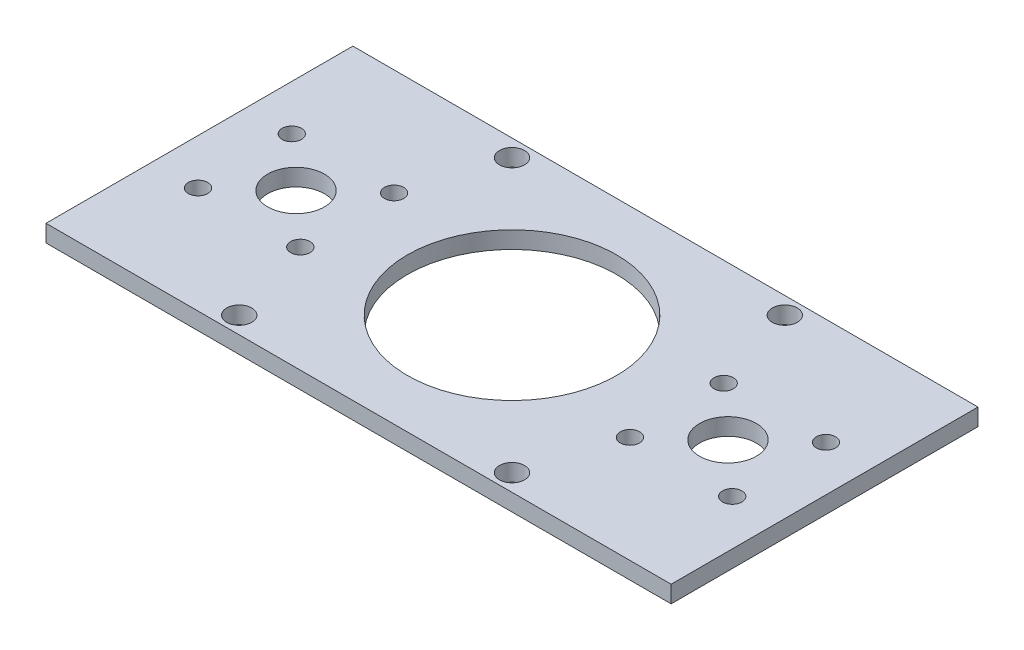
ISO-10303-21;
HEADER;
FILE_DESCRIPTION(('STEP AP214'),'2;1');
FILE_NAME('part.step','',(''),(''),'','','');
FILE_SCHEMA(('AUTOMOTIVE_DESIGN { 1 0 10303 214 1 1 1 1 }'));
ENDSEC;
DATA;
#1=APPLICATION_CONTEXT('core data for automotive mechanical design processes');
#2=APPLICATION_PROTOCOL_DEFINITION('international standard','automotive_design',2000,#1);
#3=PRODUCT_CONTEXT('',#1,'mechanical');
#4=PRODUCT('Part','Part','',(#3));
#5=PRODUCT_RELATED_PRODUCT_CATEGORY('part','',(#4));
#6=PRODUCT_DEFINITION_FORMATION('','',#4);
#7=PRODUCT_DEFINITION_CONTEXT('part definition',#1,'design');
#8=PRODUCT_DEFINITION('design','',#6,#7);
#9=PRODUCT_DEFINITION_SHAPE('','',#8);
#10=(LENGTH_UNIT() NAMED_UNIT(*) SI_UNIT(.MILLI.,.METRE.));
#11=(NAMED_UNIT(*) PLANE_ANGLE_UNIT() SI_UNIT($,.RADIAN.));
#12=(NAMED_UNIT(*) SI_UNIT($,.STERADIAN.) SOLID_ANGLE_UNIT());
#13=UNCERTAINTY_MEASURE_WITH_UNIT(LENGTH_MEASURE(1.E-05),#10,'distance_accuracy_value','');
#14=(GEOMETRIC_REPRESENTATION_CONTEXT(3) GLOBAL_UNCERTAINTY_ASSIGNED_CONTEXT((#13)) GLOBAL_UNIT_ASSIGNED_CONTEXT((#10,
#11,#12)) REPRESENTATION_CONTEXT('',''));
#15=CARTESIAN_POINT('',(0.,0.,0.));
#16=DIRECTION('',(0.,0.,1.));
#17=DIRECTION('',(1.,0.,0.));
#18=AXIS2_PLACEMENT_3D('',#15,#16,#17);
#19=CARTESIAN_POINT('',(0.,-54.75,0.));
#20=DIRECTION('',(0.,1.,0.));
#21=DIRECTION('',(-1.,0.,0.));
#22=AXIS2_PLACEMENT_3D('',#19,#20,#21);
#23=PLANE('',#22);
#24=CARTESIAN_POINT('',(29.0000000000001,-54.75,-68.25));
#25=DIRECTION('',(0.,1.,0.));
#26=DIRECTION('',(-1.,0.,0.));
#27=AXIS2_PLACEMENT_3D('',#24,#25,#26);
#28=CIRCLE('',#27,1.7);
#29=CARTESIAN_POINT('',(27.3000000000001,-54.75,-68.25));
#30=VERTEX_POINT('',#29);
#31=EDGE_CURVE('E510',#30,#30,#28,.F.);
#32=ORIENTED_EDGE('',*,*,#31,.F.);
#33=EDGE_LOOP('',(#32));
#34=FACE_BOUND('',#33,.T.);
#35=CARTESIAN_POINT('',(47.,-54.75,-68.25));
#36=DIRECTION('',(0.,1.,0.));
#37=DIRECTION('',(-1.,0.,0.));
#38=AXIS2_PLACEMENT_3D('',#35,#36,#37);
#39=CIRCLE('',#38,1.7);
#40=CARTESIAN_POINT('',(45.3,-54.75,-68.25));
#41=VERTEX_POINT('',#40);
#42=EDGE_CURVE('E113',#41,#41,#39,.F.);
#43=ORIENTED_EDGE('',*,*,#42,.F.);
#44=EDGE_LOOP('',(#43));
#45=FACE_BOUND('',#44,.T.);
#46=CARTESIAN_POINT('',(47.,-54.75,-51.75));
#47=DIRECTION('',(0.,1.,0.));
#48=DIRECTION('',(-1.,0.,0.));
#49=AXIS2_PLACEMENT_3D('',#46,#47,#48);
#50=CIRCLE('',#49,1.7);
#51=CARTESIAN_POINT('',(45.3,-54.75,-51.75));
#52=VERTEX_POINT('',#51);
#53=EDGE_CURVE('E121',#52,#52,#50,.T.);
#54=ORIENTED_EDGE('',*,*,#53,.T.);
#55=EDGE_LOOP('',(#54));
#56=FACE_BOUND('',#55,.T.);
#57=CARTESIAN_POINT('',(-47.,-54.75,-51.75));
#58=DIRECTION('',(0.,1.,0.));
#59=DIRECTION('',(-1.,0.,0.));
#60=AXIS2_PLACEMENT_3D('',#57,#58,#59);
#61=CIRCLE('',#60,1.7);
#62=CARTESIAN_POINT('',(-48.7,-54.75,-51.75));
#63=VERTEX_POINT('',#62);
#64=EDGE_CURVE('E124',#63,#63,#61,.F.);
#65=ORIENTED_EDGE('',*,*,#64,.F.);
#66=EDGE_LOOP('',(#65));
#67=FACE_BOUND('',#66,.T.);
#68=CARTESIAN_POINT('',(-47.,-54.75,-68.25));
#69=DIRECTION('',(0.,1.,0.));
#70=DIRECTION('',(-1.,0.,0.));
#71=AXIS2_PLACEMENT_3D('',#68,#69,#70);
#72=CIRCLE('',#71,1.7);
#73=CARTESIAN_POINT('',(-48.7,-54.75,-68.25));
#74=VERTEX_POINT('',#73);
#75=EDGE_CURVE('E547',#74,#74,#72,.T.);
#76=ORIENTED_EDGE('',*,*,#75,.T.);
#77=EDGE_LOOP('',(#76));
#78=FACE_BOUND('',#77,.T.);
#79=CARTESIAN_POINT('',(0.,-54.75,-60.));
#80=DIRECTION('',(0.,1.,0.));
#81=DIRECTION('',(-1.,0.,0.));
#82=AXIS2_PLACEMENT_3D('',#79,#80,#81);
#83=CIRCLE('',#82,18.4);
#84=CARTESIAN_POINT('',(-18.4,-54.75,-60.));
#85=VERTEX_POINT('',#84);
#86=EDGE_CURVE('E51',#85,#85,#83,.T.);
#87=ORIENTED_EDGE('',*,*,#86,.T.);
#88=EDGE_LOOP('',(#87));
#89=FACE_BOUND('',#88,.T.);
#90=CARTESIAN_POINT('',(-24.,-54.75,-84.));
#91=DIRECTION('',(0.,1.,0.));
#92=DIRECTION('',(-1.,0.,0.));
#93=AXIS2_PLACEMENT_3D('',#90,#91,#92);
#94=CIRCLE('',#93,2.2);
#95=CARTESIAN_POINT('',(-26.2,-54.75,-84.));
#96=VERTEX_POINT('',#95);
#97=EDGE_CURVE('E158',#96,#96,#94,.T.);
#98=ORIENTED_EDGE('',*,*,#97,.T.);
#99=EDGE_LOOP('',(#98));
#100=FACE_BOUND('',#99,.T.);
#101=CARTESIAN_POINT('',(24.,-54.75,-84.));
#102=DIRECTION('',(0.,1.,0.));
#103=DIRECTION('',(-1.,0.,0.));
#104=AXIS2_PLACEMENT_3D('',#101,#102,#103);
#105=CIRCLE('',#104,2.2);
#106=CARTESIAN_POINT('',(21.8,-54.75,-84.));
#107=VERTEX_POINT('',#106);
#108=EDGE_CURVE('E162',#107,#107,#105,.T.);
#109=ORIENTED_EDGE('',*,*,#108,.T.);
#110=EDGE_LOOP('',(#109));
#111=FACE_BOUND('',#110,.T.);
#112=CARTESIAN_POINT('',(24.,-54.75,-36.));
#113=DIRECTION('',(0.,1.,0.));
#114=DIRECTION('',(-1.,0.,0.));
#115=AXIS2_PLACEMENT_3D('',#112,#113,#114);
#116=CIRCLE('',#115,2.2);
#117=CARTESIAN_POINT('',(21.8,-54.75,-36.));
#118=VERTEX_POINT('',#117);
#119=EDGE_CURVE('E138',#118,#118,#116,.T.);
#120=ORIENTED_EDGE('',*,*,#119,.T.);
#121=EDGE_LOOP('',(#120));
#122=FACE_BOUND('',#121,.T.);
#123=CARTESIAN_POINT('',(-24.,-54.75,-36.));
#124=DIRECTION('',(0.,1.,0.));
#125=DIRECTION('',(-1.,0.,0.));
#126=AXIS2_PLACEMENT_3D('',#123,#124,#125);
#127=CIRCLE('',#126,2.2);
#128=CARTESIAN_POINT('',(-26.2,-54.75,-36.));
#129=VERTEX_POINT('',#128);
#130=EDGE_CURVE('E146',#129,#129,#127,.T.);
#131=ORIENTED_EDGE('',*,*,#130,.T.);
#132=EDGE_LOOP('',(#131));
#133=FACE_BOUND('',#132,.T.);
#134=DIRECTION('',(0.,0.,1.));
#135=VECTOR('',#134,1.);
#136=CARTESIAN_POINT('',(55.,-54.75,0.));
#137=LINE('',#136,#135);
#138=CARTESIAN_POINT('',(55.,-54.7500000000001,-87.));
#139=VERTEX_POINT('',#138);
#140=CARTESIAN_POINT('',(55.,-54.75,-33.));
#141=VERTEX_POINT('',#140);
#142=EDGE_CURVE('E517',#139,#141,#137,.T.);
#143=ORIENTED_EDGE('',*,*,#142,.T.);
#144=DIRECTION('',(-1.,0.,0.));
#145=VECTOR('',#144,1.);
#146=CARTESIAN_POINT('',(0.,-54.7500000000001,-33.));
#147=LINE('',#146,#145);
#148=CARTESIAN_POINT('',(-55.,-54.7500000000001,-33.));
#149=VERTEX_POINT('',#148);
#150=EDGE_CURVE('E63',#141,#149,#147,.T.);
#151=ORIENTED_EDGE('',*,*,#150,.T.);
#152=DIRECTION('',(0.,0.,1.));
#153=VECTOR('',#152,1.);
#154=CARTESIAN_POINT('',(-55.,-54.75,0.));
#155=LINE('',#154,#153);
#156=CARTESIAN_POINT('',(-55.,-54.7500000000001,-87.));
#157=VERTEX_POINT('',#156);
#158=EDGE_CURVE('E106',#157,#149,#155,.T.);
#159=ORIENTED_EDGE('',*,*,#158,.F.);
#160=DIRECTION('',(1.,0.,0.));
#161=VECTOR('',#160,1.);
#162=CARTESIAN_POINT('',(0.,-54.7500000000001,-87.));
#163=LINE('',#162,#161);
#164=EDGE_CURVE('E603',#157,#139,#163,.T.);
#165=ORIENTED_EDGE('',*,*,#164,.T.);
#166=EDGE_LOOP('',(#143,#151,#159,#165));
#167=FACE_BOUND('',#166,.T.);
#168=CARTESIAN_POINT('',(-38.,-54.75,-60.));
#169=DIRECTION('',(0.,1.,0.));
#170=DIRECTION('',(-1.,0.,0.));
#171=AXIS2_PLACEMENT_3D('',#168,#169,#170);
#172=CIRCLE('',#171,5.);
#173=CARTESIAN_POINT('',(-43.,-54.75,-60.));
#174=VERTEX_POINT('',#173);
#175=EDGE_CURVE('E544',#174,#174,#172,.F.);
#176=ORIENTED_EDGE('',*,*,#175,.F.);
#177=EDGE_LOOP('',(#176));
#178=FACE_BOUND('',#177,.T.);
#179=CARTESIAN_POINT('',(-29.0000000000001,-54.7500000000001,-68.25));
#180=DIRECTION('',(0.,1.,0.));
#181=DIRECTION('',(-1.,0.,0.));
#182=AXIS2_PLACEMENT_3D('',#179,#180,#181);
#183=CIRCLE('',#182,1.7);
#184=CARTESIAN_POINT('',(-30.7000000000001,-54.7500000000001,-68.25));
#185=VERTEX_POINT('',#184);
#186=EDGE_CURVE('E493',#185,#185,#183,.T.);
#187=ORIENTED_EDGE('',*,*,#186,.T.);
#188=EDGE_LOOP('',(#187));
#189=FACE_BOUND('',#188,.T.);
#190=CARTESIAN_POINT('',(-29.,-54.7500000000001,-51.75));
#191=DIRECTION('',(0.,1.,0.));
#192=DIRECTION('',(-1.,0.,0.));
#193=AXIS2_PLACEMENT_3D('',#190,#191,#192);
#194=CIRCLE('',#193,1.7);
#195=CARTESIAN_POINT('',(-30.7,-54.7500000000001,-51.75));
#196=VERTEX_POINT('',#195);
#197=EDGE_CURVE('E502',#196,#196,#194,.T.);
#198=ORIENTED_EDGE('',*,*,#197,.T.);
#199=EDGE_LOOP('',(#198));
#200=FACE_BOUND('',#199,.T.);
#201=CARTESIAN_POINT('',(38.,-54.75,-60.));
#202=DIRECTION('',(0.,1.,0.));
#203=DIRECTION('',(-1.,0.,0.));
#204=AXIS2_PLACEMENT_3D('',#201,#202,#203);
#205=CIRCLE('',#204,5.);
#206=CARTESIAN_POINT('',(33.,-54.75,-60.));
#207=VERTEX_POINT('',#206);
#208=EDGE_CURVE('E521',#207,#207,#205,.T.);
#209=ORIENTED_EDGE('',*,*,#208,.T.);
#210=EDGE_LOOP('',(#209));
#211=FACE_BOUND('',#210,.T.);
#212=CARTESIAN_POINT('',(29.,-54.75,-51.75));
#213=DIRECTION('',(0.,1.,0.));
#214=DIRECTION('',(-1.,0.,0.));
#215=AXIS2_PLACEMENT_3D('',#212,#213,#214);
#216=CIRCLE('',#215,1.7);
#217=CARTESIAN_POINT('',(27.3,-54.75,-51.75));
#218=VERTEX_POINT('',#217);
#219=EDGE_CURVE('E479',#218,#218,#216,.F.);
#220=ORIENTED_EDGE('',*,*,#219,.F.);
#221=EDGE_LOOP('',(#220));
#222=FACE_BOUND('',#221,.T.);
#223=ADVANCED_FACE('F47',(#34,#45,#56,#67,#78,#89,#100,#111,#122,#133,#167,#178,#189,#200,#211,
#222),#23,.F.);
#224=CARTESIAN_POINT('',(0.,-51.75,0.));
#225=DIRECTION('',(0.,1.,0.));
#226=DIRECTION('',(-1.,0.,0.));
#227=AXIS2_PLACEMENT_3D('',#224,#225,#226);
#228=PLANE('',#227);
#229=DIRECTION('',(-1.,0.,0.));
#230=VECTOR('',#229,1.);
#231=CARTESIAN_POINT('',(0.,-51.75,-33.));
#232=LINE('',#231,#230);
#233=CARTESIAN_POINT('',(55.,-51.75,-33.));
#234=VERTEX_POINT('',#233);
#235=CARTESIAN_POINT('',(-55.,-51.75,-33.));
#236=VERTEX_POINT('',#235);
#237=EDGE_CURVE('E87',#234,#236,#232,.T.);
#238=ORIENTED_EDGE('',*,*,#237,.F.);
#239=DIRECTION('',(0.,0.,1.));
#240=VECTOR('',#239,1.);
#241=CARTESIAN_POINT('',(55.,-51.75,0.));
#242=LINE('',#241,#240);
#243=CARTESIAN_POINT('',(55.,-51.75,-87.));
#244=VERTEX_POINT('',#243);
#245=EDGE_CURVE('E497',#244,#234,#242,.T.);
#246=ORIENTED_EDGE('',*,*,#245,.F.);
#247=DIRECTION('',(1.,0.,0.));
#248=VECTOR('',#247,1.);
#249=CARTESIAN_POINT('',(0.,-51.75,-87.));
#250=LINE('',#249,#248);
#251=CARTESIAN_POINT('',(-55.,-51.75,-87.));
#252=VERTEX_POINT('',#251);
#253=EDGE_CURVE('E71',#252,#244,#250,.T.);
#254=ORIENTED_EDGE('',*,*,#253,.F.);
#255=DIRECTION('',(0.,0.,1.));
#256=VECTOR('',#255,1.);
#257=CARTESIAN_POINT('',(-55.,-51.75,0.));
#258=LINE('',#257,#256);
#259=EDGE_CURVE('E104',#252,#236,#258,.T.);
#260=ORIENTED_EDGE('',*,*,#259,.T.);
#261=EDGE_LOOP('',(#238,#246,#254,#260));
#262=FACE_BOUND('',#261,.T.);
#263=CARTESIAN_POINT('',(-38.,-51.75,-60.));
#264=DIRECTION('',(0.,1.,0.));
#265=DIRECTION('',(-1.,0.,0.));
#266=AXIS2_PLACEMENT_3D('',#263,#264,#265);
#267=CIRCLE('',#266,5.);
#268=CARTESIAN_POINT('',(-43.,-51.75,-60.));
#269=VERTEX_POINT('',#268);
#270=EDGE_CURVE('E112',#269,#269,#267,.F.);
#271=ORIENTED_EDGE('',*,*,#270,.T.);
#272=EDGE_LOOP('',(#271));
#273=FACE_BOUND('',#272,.T.);
#274=CARTESIAN_POINT('',(38.,-51.75,-60.));
#275=DIRECTION('',(0.,1.,0.));
#276=DIRECTION('',(-1.,0.,0.));
#277=AXIS2_PLACEMENT_3D('',#274,#275,#276);
#278=CIRCLE('',#277,5.);
#279=CARTESIAN_POINT('',(33.,-51.75,-60.));
#280=VERTEX_POINT('',#279);
#281=EDGE_CURVE('E531',#280,#280,#278,.T.);
#282=ORIENTED_EDGE('',*,*,#281,.F.);
#283=EDGE_LOOP('',(#282));
#284=FACE_BOUND('',#283,.T.);
#285=CARTESIAN_POINT('',(29.0000000000001,-51.75,-68.25));
#286=DIRECTION('',(0.,1.,0.));
#287=DIRECTION('',(-1.,0.,0.));
#288=AXIS2_PLACEMENT_3D('',#285,#286,#287);
#289=CIRCLE('',#288,1.7);
#290=CARTESIAN_POINT('',(27.3000000000001,-51.75,-68.25));
#291=VERTEX_POINT('',#290);
#292=EDGE_CURVE('E488',#291,#291,#289,.F.);
#293=ORIENTED_EDGE('',*,*,#292,.T.);
#294=EDGE_LOOP('',(#293));
#295=FACE_BOUND('',#294,.T.);
#296=CARTESIAN_POINT('',(-29.,-51.75,-51.75));
#297=DIRECTION('',(0.,1.,0.));
#298=DIRECTION('',(-1.,0.,0.));
#299=AXIS2_PLACEMENT_3D('',#296,#297,#298);
#300=CIRCLE('',#299,1.7);
#301=CARTESIAN_POINT('',(-30.7,-51.75,-51.75));
#302=VERTEX_POINT('',#301);
#303=EDGE_CURVE('E506',#302,#302,#300,.T.);
#304=ORIENTED_EDGE('',*,*,#303,.F.);
#305=EDGE_LOOP('',(#304));
#306=FACE_BOUND('',#305,.T.);
#307=CARTESIAN_POINT('',(-29.0000000000001,-51.75,-68.25));
#308=DIRECTION('',(0.,1.,0.));
#309=DIRECTION('',(-1.,0.,0.));
#310=AXIS2_PLACEMENT_3D('',#307,#308,#309);
#311=CIRCLE('',#310,1.7);
#312=CARTESIAN_POINT('',(-30.7000000000001,-51.75,-68.25));
#313=VERTEX_POINT('',#312);
#314=EDGE_CURVE('E498',#313,#313,#311,.T.);
#315=ORIENTED_EDGE('',*,*,#314,.F.);
#316=EDGE_LOOP('',(#315));
#317=FACE_BOUND('',#316,.T.);
#318=CARTESIAN_POINT('',(-24.,-51.75,-36.));
#319=DIRECTION('',(0.,1.,0.));
#320=DIRECTION('',(-1.,0.,0.));
#321=AXIS2_PLACEMENT_3D('',#318,#319,#320);
#322=CIRCLE('',#321,2.2);
#323=CARTESIAN_POINT('',(-26.2,-51.75,-36.));
#324=VERTEX_POINT('',#323);
#325=EDGE_CURVE('E134',#324,#324,#322,.T.);
#326=ORIENTED_EDGE('',*,*,#325,.F.);
#327=EDGE_LOOP('',(#326));
#328=FACE_BOUND('',#327,.T.);
#329=CARTESIAN_POINT('',(24.,-51.75,-36.));
#330=DIRECTION('',(0.,1.,0.));
#331=DIRECTION('',(-1.,0.,0.));
#332=AXIS2_PLACEMENT_3D('',#329,#330,#331);
#333=CIRCLE('',#332,2.2);
#334=CARTESIAN_POINT('',(21.8,-51.75,-36.));
#335=VERTEX_POINT('',#334);
#336=EDGE_CURVE('E139',#335,#335,#333,.T.);
#337=ORIENTED_EDGE('',*,*,#336,.F.);
#338=EDGE_LOOP('',(#337));
#339=FACE_BOUND('',#338,.T.);
#340=CARTESIAN_POINT('',(24.,-51.75,-84.));
#341=DIRECTION('',(0.,1.,0.));
#342=DIRECTION('',(1.,0.,0.));
#343=AXIS2_PLACEMENT_3D('',#340,#341,#342);
#344=CIRCLE('',#343,2.2);
#345=CARTESIAN_POINT('',(26.2,-51.75,-84.));
#346=VERTEX_POINT('',#345);
#347=EDGE_CURVE('E150',#346,#346,#344,.T.);
#348=ORIENTED_EDGE('',*,*,#347,.F.);
#349=EDGE_LOOP('',(#348));
#350=FACE_BOUND('',#349,.T.);
#351=CARTESIAN_POINT('',(-24.,-51.75,-84.));
#352=DIRECTION('',(0.,1.,0.));
#353=DIRECTION('',(-1.,0.,0.));
#354=AXIS2_PLACEMENT_3D('',#351,#352,#353);
#355=CIRCLE('',#354,2.2);
#356=CARTESIAN_POINT('',(-26.2,-51.75,-84.));
#357=VERTEX_POINT('',#356);
#358=EDGE_CURVE('E154',#357,#357,#355,.T.);
#359=ORIENTED_EDGE('',*,*,#358,.F.);
#360=EDGE_LOOP('',(#359));
#361=FACE_BOUND('',#360,.T.);
#362=CARTESIAN_POINT('',(0.,-51.75,-60.));
#363=DIRECTION('',(0.,1.,0.));
#364=DIRECTION('',(-1.,0.,0.));
#365=AXIS2_PLACEMENT_3D('',#362,#363,#364);
#366=CIRCLE('',#365,18.4);
#367=CARTESIAN_POINT('',(-18.4,-51.75,-60.));
#368=VERTEX_POINT('',#367);
#369=EDGE_CURVE('E11',#368,#368,#366,.T.);
#370=ORIENTED_EDGE('',*,*,#369,.F.);
#371=EDGE_LOOP('',(#370));
#372=FACE_BOUND('',#371,.T.);
#373=CARTESIAN_POINT('',(-47.,-51.75,-68.25));
#374=DIRECTION('',(0.,1.,0.));
#375=DIRECTION('',(-1.,0.,0.));
#376=AXIS2_PLACEMENT_3D('',#373,#374,#375);
#377=CIRCLE('',#376,1.7);
#378=CARTESIAN_POINT('',(-48.7,-51.75,-68.25));
#379=VERTEX_POINT('',#378);
#380=EDGE_CURVE('E118',#379,#379,#377,.T.);
#381=ORIENTED_EDGE('',*,*,#380,.F.);
#382=EDGE_LOOP('',(#381));
#383=FACE_BOUND('',#382,.T.);
#384=CARTESIAN_POINT('',(-47.,-51.75,-51.75));
#385=DIRECTION('',(0.,1.,0.));
#386=DIRECTION('',(-1.,0.,0.));
#387=AXIS2_PLACEMENT_3D('',#384,#385,#386);
#388=CIRCLE('',#387,1.7);
#389=CARTESIAN_POINT('',(-48.7,-51.75,-51.75));
#390=VERTEX_POINT('',#389);
#391=EDGE_CURVE('E130',#390,#390,#388,.F.);
#392=ORIENTED_EDGE('',*,*,#391,.T.);
#393=EDGE_LOOP('',(#392));
#394=FACE_BOUND('',#393,.T.);
#395=CARTESIAN_POINT('',(47.,-51.75,-51.75));
#396=DIRECTION('',(0.,1.,0.));
#397=DIRECTION('',(-1.,0.,0.));
#398=AXIS2_PLACEMENT_3D('',#395,#396,#397);
#399=CIRCLE('',#398,1.7);
#400=CARTESIAN_POINT('',(45.3,-51.75,-51.75));
#401=VERTEX_POINT('',#400);
#402=EDGE_CURVE('E535',#401,#401,#399,.T.);
#403=ORIENTED_EDGE('',*,*,#402,.F.);
#404=EDGE_LOOP('',(#403));
#405=FACE_BOUND('',#404,.T.);
#406=CARTESIAN_POINT('',(47.,-51.75,-68.25));
#407=DIRECTION('',(0.,1.,0.));
#408=DIRECTION('',(-1.,0.,0.));
#409=AXIS2_PLACEMENT_3D('',#406,#407,#408);
#410=CIRCLE('',#409,1.7);
#411=CARTESIAN_POINT('',(45.3,-51.75,-68.25));
#412=VERTEX_POINT('',#411);
#413=EDGE_CURVE('E522',#412,#412,#410,.F.);
#414=ORIENTED_EDGE('',*,*,#413,.T.);
#415=EDGE_LOOP('',(#414));
#416=FACE_BOUND('',#415,.T.);
#417=CARTESIAN_POINT('',(29.,-51.75,-51.75));
#418=DIRECTION('',(0.,1.,0.));
#419=DIRECTION('',(-1.,0.,0.));
#420=AXIS2_PLACEMENT_3D('',#417,#418,#419);
#421=CIRCLE('',#420,1.7);
#422=CARTESIAN_POINT('',(27.3,-51.75,-51.75));
#423=VERTEX_POINT('',#422);
#424=EDGE_CURVE('E482',#423,#423,#421,.F.);
#425=ORIENTED_EDGE('',*,*,#424,.T.);
#426=EDGE_LOOP('',(#425));
#427=FACE_BOUND('',#426,.T.);
#428=ADVANCED_FACE('F109',(#262,#273,#284,#295,#306,#317,#328,#339,#350,#361,#372,#383,#394,
#405,#416,#427),#228,.T.);
#429=CARTESIAN_POINT('',(0.,-51.75,-60.));
#430=DIRECTION('',(0.,-1.,0.));
#431=DIRECTION('',(1.,0.,0.));
#432=AXIS2_PLACEMENT_3D('',#429,#430,#431);
#433=CYLINDRICAL_SURFACE('',#432,18.4);
#434=ORIENTED_EDGE('',*,*,#369,.T.);
#435=EDGE_LOOP('',(#434));
#436=FACE_BOUND('',#435,.T.);
#437=ORIENTED_EDGE('',*,*,#86,.F.);
#438=EDGE_LOOP('',(#437));
#439=FACE_BOUND('',#438,.T.);
#440=ADVANCED_FACE('F49',(#436,#439),#433,.F.);
#441=CARTESIAN_POINT('',(-24.,-104.75,-84.));
#442=DIRECTION('',(0.,1.,0.));
#443=DIRECTION('',(-1.,0.,0.));
#444=AXIS2_PLACEMENT_3D('',#441,#442,#443);
#445=CYLINDRICAL_SURFACE('',#444,2.2);
#446=ORIENTED_EDGE('',*,*,#358,.T.);
#447=EDGE_LOOP('',(#446));
#448=FACE_BOUND('',#447,.T.);
#449=ORIENTED_EDGE('',*,*,#97,.F.);
#450=EDGE_LOOP('',(#449));
#451=FACE_BOUND('',#450,.T.);
#452=ADVANCED_FACE('F174',(#448,#451),#445,.F.);
#453=CARTESIAN_POINT('',(24.,-104.75,-84.));
#454=DIRECTION('',(0.,1.,0.));
#455=DIRECTION('',(-1.,0.,0.));
#456=AXIS2_PLACEMENT_3D('',#453,#454,#455);
#457=CYLINDRICAL_SURFACE('',#456,2.2);
#458=ORIENTED_EDGE('',*,*,#347,.T.);
#459=EDGE_LOOP('',(#458));
#460=FACE_BOUND('',#459,.T.);
#461=ORIENTED_EDGE('',*,*,#108,.F.);
#462=EDGE_LOOP('',(#461));
#463=FACE_BOUND('',#462,.T.);
#464=ADVANCED_FACE('F179',(#460,#463),#457,.F.);
#465=CARTESIAN_POINT('',(24.,-104.75,-36.));
#466=DIRECTION('',(0.,1.,0.));
#467=DIRECTION('',(-1.,0.,0.));
#468=AXIS2_PLACEMENT_3D('',#465,#466,#467);
#469=CYLINDRICAL_SURFACE('',#468,2.2);
#470=ORIENTED_EDGE('',*,*,#336,.T.);
#471=EDGE_LOOP('',(#470));
#472=FACE_BOUND('',#471,.T.);
#473=ORIENTED_EDGE('',*,*,#119,.F.);
#474=EDGE_LOOP('',(#473));
#475=FACE_BOUND('',#474,.T.);
#476=ADVANCED_FACE('F194',(#472,#475),#469,.F.);
#477=CARTESIAN_POINT('',(-24.,-104.75,-36.));
#478=DIRECTION('',(0.,1.,0.));
#479=DIRECTION('',(-1.,0.,0.));
#480=AXIS2_PLACEMENT_3D('',#477,#478,#479);
#481=CYLINDRICAL_SURFACE('',#480,2.2);
#482=ORIENTED_EDGE('',*,*,#325,.T.);
#483=EDGE_LOOP('',(#482));
#484=FACE_BOUND('',#483,.T.);
#485=ORIENTED_EDGE('',*,*,#130,.F.);
#486=EDGE_LOOP('',(#485));
#487=FACE_BOUND('',#486,.T.);
#488=ADVANCED_FACE('F198',(#484,#487),#481,.F.);
#489=CARTESIAN_POINT('',(-38.,-54.75,-60.));
#490=DIRECTION('',(0.,1.,0.));
#491=DIRECTION('',(-1.,0.,0.));
#492=AXIS2_PLACEMENT_3D('',#489,#490,#491);
#493=CYLINDRICAL_SURFACE('',#492,5.);
#494=ORIENTED_EDGE('',*,*,#270,.F.);
#495=EDGE_LOOP('',(#494));
#496=FACE_BOUND('',#495,.T.);
#497=ORIENTED_EDGE('',*,*,#175,.T.);
#498=EDGE_LOOP('',(#497));
#499=FACE_BOUND('',#498,.T.);
#500=ADVANCED_FACE('F202',(#496,#499),#493,.F.);
#501=CARTESIAN_POINT('',(-55.,-54.75,0.));
#502=DIRECTION('',(-1.,0.,0.));
#503=DIRECTION('',(0.,0.,1.));
#504=AXIS2_PLACEMENT_3D('',#501,#502,#503);
#505=PLANE('',#504);
#506=DIRECTION('',(0.,1.,0.));
#507=VECTOR('',#506,1.);
#508=CARTESIAN_POINT('',(-55.,-54.7500000000001,-33.));
#509=LINE('',#508,#507);
#510=EDGE_CURVE('E90',#149,#236,#509,.T.);
#511=ORIENTED_EDGE('',*,*,#510,.T.);
#512=ORIENTED_EDGE('',*,*,#259,.F.);
#513=DIRECTION('',(0.,1.,0.));
#514=VECTOR('',#513,1.);
#515=CARTESIAN_POINT('',(-55.,-54.7500000000001,-87.));
#516=LINE('',#515,#514);
#517=EDGE_CURVE('E605',#157,#252,#516,.T.);
#518=ORIENTED_EDGE('',*,*,#517,.F.);
#519=ORIENTED_EDGE('',*,*,#158,.T.);
#520=EDGE_LOOP('',(#511,#512,#518,#519));
#521=FACE_BOUND('',#520,.T.);
#522=ADVANCED_FACE('F102',(#521),#505,.T.);
#523=CARTESIAN_POINT('',(-47.,-54.75,-68.25));
#524=DIRECTION('',(0.,1.,0.));
#525=DIRECTION('',(-1.,0.,0.));
#526=AXIS2_PLACEMENT_3D('',#523,#524,#525);
#527=CYLINDRICAL_SURFACE('',#526,1.7);
#528=ORIENTED_EDGE('',*,*,#75,.F.);
#529=EDGE_LOOP('',(#528));
#530=FACE_BOUND('',#529,.T.);
#531=ORIENTED_EDGE('',*,*,#380,.T.);
#532=EDGE_LOOP('',(#531));
#533=FACE_BOUND('',#532,.T.);
#534=ADVANCED_FACE('F206',(#530,#533),#527,.F.);
#535=CARTESIAN_POINT('',(-47.,-54.75,-51.75));
#536=DIRECTION('',(0.,1.,0.));
#537=DIRECTION('',(-1.,0.,0.));
#538=AXIS2_PLACEMENT_3D('',#535,#536,#537);
#539=CYLINDRICAL_SURFACE('',#538,1.7);
#540=ORIENTED_EDGE('',*,*,#64,.T.);
#541=EDGE_LOOP('',(#540));
#542=FACE_BOUND('',#541,.T.);
#543=ORIENTED_EDGE('',*,*,#391,.F.);
#544=EDGE_LOOP('',(#543));
#545=FACE_BOUND('',#544,.T.);
#546=ADVANCED_FACE('F212',(#542,#545),#539,.F.);
#547=CARTESIAN_POINT('',(55.,-54.75,0.));
#548=DIRECTION('',(-1.,0.,0.));
#549=DIRECTION('',(0.,0.,1.));
#550=AXIS2_PLACEMENT_3D('',#547,#548,#549);
#551=PLANE('',#550);
#552=ORIENTED_EDGE('',*,*,#245,.T.);
#553=DIRECTION('',(0.,1.,0.));
#554=VECTOR('',#553,1.);
#555=CARTESIAN_POINT('',(55.,-54.7500000000001,-33.));
#556=LINE('',#555,#554);
#557=EDGE_CURVE('E91',#141,#234,#556,.T.);
#558=ORIENTED_EDGE('',*,*,#557,.F.);
#559=ORIENTED_EDGE('',*,*,#142,.F.);
#560=DIRECTION('',(0.,1.,0.));
#561=VECTOR('',#560,1.);
#562=CARTESIAN_POINT('',(55.,-54.7500000000001,-87.));
#563=LINE('',#562,#561);
#564=EDGE_CURVE('E97',#139,#244,#563,.T.);
#565=ORIENTED_EDGE('',*,*,#564,.T.);
#566=EDGE_LOOP('',(#552,#558,#559,#565));
#567=FACE_BOUND('',#566,.T.);
#568=ADVANCED_FACE('F216',(#567),#551,.F.);
#569=CARTESIAN_POINT('',(38.,-54.75,-60.));
#570=DIRECTION('',(0.,1.,0.));
#571=DIRECTION('',(-1.,0.,0.));
#572=AXIS2_PLACEMENT_3D('',#569,#570,#571);
#573=CYLINDRICAL_SURFACE('',#572,5.);
#574=ORIENTED_EDGE('',*,*,#281,.T.);
#575=EDGE_LOOP('',(#574));
#576=FACE_BOUND('',#575,.T.);
#577=ORIENTED_EDGE('',*,*,#208,.F.);
#578=EDGE_LOOP('',(#577));
#579=FACE_BOUND('',#578,.T.);
#580=ADVANCED_FACE('F220',(#576,#579),#573,.F.);
#581=CARTESIAN_POINT('',(47.,-54.75,-51.75));
#582=DIRECTION('',(0.,1.,0.));
#583=DIRECTION('',(-1.,0.,0.));
#584=AXIS2_PLACEMENT_3D('',#581,#582,#583);
#585=CYLINDRICAL_SURFACE('',#584,1.7);
#586=ORIENTED_EDGE('',*,*,#53,.F.);
#587=EDGE_LOOP('',(#586));
#588=FACE_BOUND('',#587,.T.);
#589=ORIENTED_EDGE('',*,*,#402,.T.);
#590=EDGE_LOOP('',(#589));
#591=FACE_BOUND('',#590,.T.);
#592=ADVANCED_FACE('F224',(#588,#591),#585,.F.);
#593=CARTESIAN_POINT('',(47.,-54.75,-68.25));
#594=DIRECTION('',(0.,1.,0.));
#595=DIRECTION('',(-1.,0.,0.));
#596=AXIS2_PLACEMENT_3D('',#593,#594,#595);
#597=CYLINDRICAL_SURFACE('',#596,1.7);
#598=ORIENTED_EDGE('',*,*,#42,.T.);
#599=EDGE_LOOP('',(#598));
#600=FACE_BOUND('',#599,.T.);
#601=ORIENTED_EDGE('',*,*,#413,.F.);
#602=EDGE_LOOP('',(#601));
#603=FACE_BOUND('',#602,.T.);
#604=ADVANCED_FACE('F228',(#600,#603),#597,.F.);
#605=CARTESIAN_POINT('',(-29.0000000000001,-54.7500000000001,-68.25));
#606=DIRECTION('',(0.,1.,0.));
#607=DIRECTION('',(-1.,0.,0.));
#608=AXIS2_PLACEMENT_3D('',#605,#606,#607);
#609=CYLINDRICAL_SURFACE('',#608,1.7);
#610=ORIENTED_EDGE('',*,*,#186,.F.);
#611=EDGE_LOOP('',(#610));
#612=FACE_BOUND('',#611,.T.);
#613=ORIENTED_EDGE('',*,*,#314,.T.);
#614=EDGE_LOOP('',(#613));
#615=FACE_BOUND('',#614,.T.);
#616=ADVANCED_FACE('F232',(#612,#615),#609,.F.);
#617=CARTESIAN_POINT('',(-29.,-54.7500000000001,-51.75));
#618=DIRECTION('',(0.,1.,0.));
#619=DIRECTION('',(-1.,0.,0.));
#620=AXIS2_PLACEMENT_3D('',#617,#618,#619);
#621=CYLINDRICAL_SURFACE('',#620,1.7);
#622=ORIENTED_EDGE('',*,*,#197,.F.);
#623=EDGE_LOOP('',(#622));
#624=FACE_BOUND('',#623,.T.);
#625=ORIENTED_EDGE('',*,*,#303,.T.);
#626=EDGE_LOOP('',(#625));
#627=FACE_BOUND('',#626,.T.);
#628=ADVANCED_FACE('F238',(#624,#627),#621,.F.);
#629=CARTESIAN_POINT('',(29.0000000000001,-54.75,-68.25));
#630=DIRECTION('',(0.,1.,0.));
#631=DIRECTION('',(-1.,0.,0.));
#632=AXIS2_PLACEMENT_3D('',#629,#630,#631);
#633=CYLINDRICAL_SURFACE('',#632,1.7);
#634=ORIENTED_EDGE('',*,*,#31,.T.);
#635=EDGE_LOOP('',(#634));
#636=FACE_BOUND('',#635,.T.);
#637=ORIENTED_EDGE('',*,*,#292,.F.);
#638=EDGE_LOOP('',(#637));
#639=FACE_BOUND('',#638,.T.);
#640=ADVANCED_FACE('F234',(#636,#639),#633,.F.);
#641=CARTESIAN_POINT('',(29.,-54.75,-51.75));
#642=DIRECTION('',(0.,1.,0.));
#643=DIRECTION('',(-1.,0.,0.));
#644=AXIS2_PLACEMENT_3D('',#641,#642,#643);
#645=CYLINDRICAL_SURFACE('',#644,1.7);
#646=ORIENTED_EDGE('',*,*,#219,.T.);
#647=EDGE_LOOP('',(#646));
#648=FACE_BOUND('',#647,.T.);
#649=ORIENTED_EDGE('',*,*,#424,.F.);
#650=EDGE_LOOP('',(#649));
#651=FACE_BOUND('',#650,.T.);
#652=ADVANCED_FACE('F237',(#648,#651),#645,.F.);
#653=CARTESIAN_POINT('',(0.,-54.7500000000001,-87.));
#654=DIRECTION('',(0.,0.,1.));
#655=DIRECTION('',(0.,-1.,0.));
#656=AXIS2_PLACEMENT_3D('',#653,#654,#655);
#657=PLANE('',#656);
#658=ORIENTED_EDGE('',*,*,#253,.T.);
#659=ORIENTED_EDGE('',*,*,#564,.F.);
#660=ORIENTED_EDGE('',*,*,#164,.F.);
#661=ORIENTED_EDGE('',*,*,#517,.T.);
#662=EDGE_LOOP('',(#658,#659,#660,#661));
#663=FACE_BOUND('',#662,.T.);
#664=ADVANCED_FACE('F247',(#663),#657,.F.);
#665=CARTESIAN_POINT('',(0.,-54.7500000000001,-33.));
#666=DIRECTION('',(0.,0.,-1.));
#667=DIRECTION('',(-1.,0.,0.));
#668=AXIS2_PLACEMENT_3D('',#665,#666,#667);
#669=PLANE('',#668);
#670=ORIENTED_EDGE('',*,*,#237,.T.);
#671=ORIENTED_EDGE('',*,*,#510,.F.);
#672=ORIENTED_EDGE('',*,*,#150,.F.);
#673=ORIENTED_EDGE('',*,*,#557,.T.);
#674=EDGE_LOOP('',(#670,#671,#672,#673));
#675=FACE_BOUND('',#674,.T.);
#676=ADVANCED_FACE('F89',(#675),#669,.F.);
#677=CLOSED_SHELL('',(#223,#428,#440,#452,#464,#476,#488,#500,#522,#534,#546,#568,#580,#592,
#604,#616,#628,#640,#652,#664,#676));
#678=MANIFOLD_SOLID_BREP('B2',#677);
#679=ADVANCED_BREP_SHAPE_REPRESENTATION('',(#18,#678),#14);
#680=SHAPE_DEFINITION_REPRESENTATION(#9,#679);
ENDSEC;
END-ISO-10303-21;
